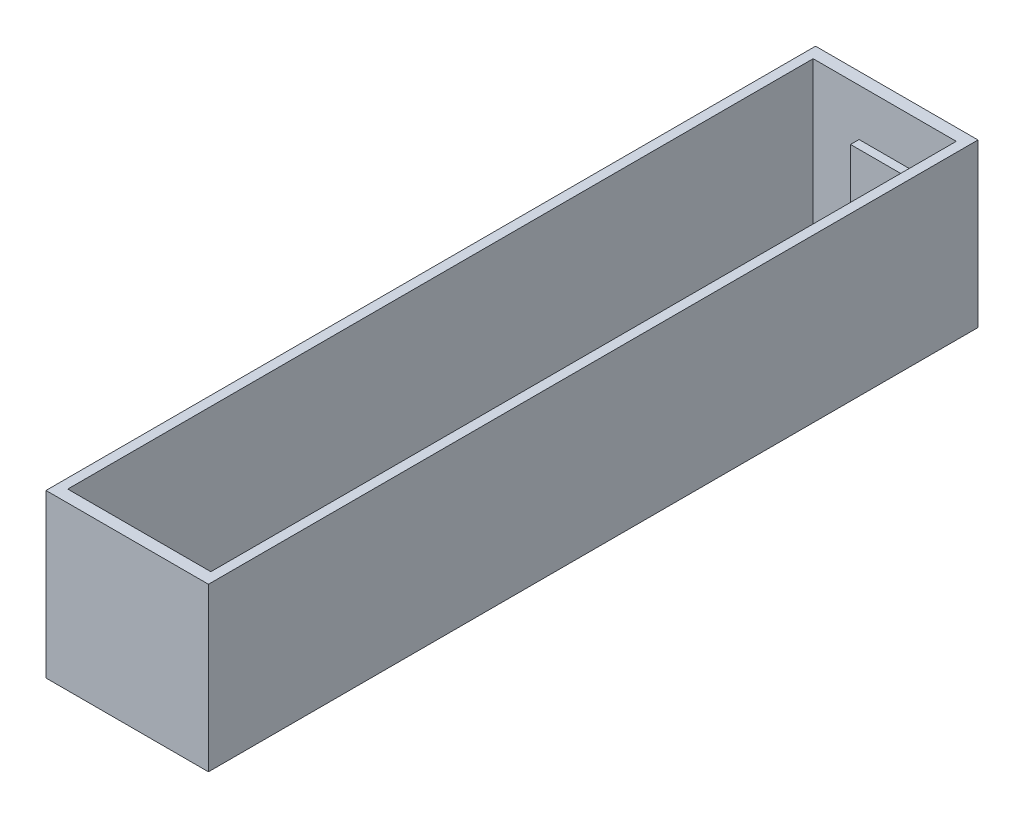
ISO-10303-21;
HEADER;
FILE_DESCRIPTION(('STEP AP214'),'2;1');
FILE_NAME('part.step','',(''),(''),'','','');
FILE_SCHEMA(('AUTOMOTIVE_DESIGN { 1 0 10303 214 1 1 1 1 }'));
ENDSEC;
DATA;
#1=APPLICATION_CONTEXT('core data for automotive mechanical design processes');
#2=APPLICATION_PROTOCOL_DEFINITION('international standard','automotive_design',2000,#1);
#3=PRODUCT_CONTEXT('',#1,'mechanical');
#4=PRODUCT('Part','Part','',(#3));
#5=PRODUCT_RELATED_PRODUCT_CATEGORY('part','',(#4));
#6=PRODUCT_DEFINITION_FORMATION('','',#4);
#7=PRODUCT_DEFINITION_CONTEXT('part definition',#1,'design');
#8=PRODUCT_DEFINITION('design','',#6,#7);
#9=PRODUCT_DEFINITION_SHAPE('','',#8);
#10=(LENGTH_UNIT() NAMED_UNIT(*) SI_UNIT(.MILLI.,.METRE.));
#11=(NAMED_UNIT(*) PLANE_ANGLE_UNIT() SI_UNIT($,.RADIAN.));
#12=(NAMED_UNIT(*) SI_UNIT($,.STERADIAN.) SOLID_ANGLE_UNIT());
#13=UNCERTAINTY_MEASURE_WITH_UNIT(LENGTH_MEASURE(1.E-05),#10,'distance_accuracy_value','');
#14=(GEOMETRIC_REPRESENTATION_CONTEXT(3) GLOBAL_UNCERTAINTY_ASSIGNED_CONTEXT((#13)) GLOBAL_UNIT_ASSIGNED_CONTEXT((#10,
#11,#12)) REPRESENTATION_CONTEXT('',''));
#15=CARTESIAN_POINT('',(0.,0.,0.));
#16=DIRECTION('',(0.,0.,1.));
#17=DIRECTION('',(1.,0.,0.));
#18=AXIS2_PLACEMENT_3D('',#15,#16,#17);
#19=CARTESIAN_POINT('',(-11.9698623853211,2.,-75.3913176046101));
#20=DIRECTION('',(0.,0.,-1.));
#21=DIRECTION('',(-1.,0.,0.));
#22=AXIS2_PLACEMENT_3D('',#19,#20,#21);
#23=PLANE('',#22);
#24=DIRECTION('',(-1.,0.,0.));
#25=VECTOR('',#24,1.);
#26=CARTESIAN_POINT('',(-11.9698623853211,19.,-75.3913176046101));
#27=LINE('',#26,#25);
#28=CARTESIAN_POINT('',(4.77013761467889,19.,-75.3913176046101));
#29=VERTEX_POINT('',#28);
#30=CARTESIAN_POINT('',(-11.9698623853211,19.,-75.3913176046101));
#31=VERTEX_POINT('',#30);
#32=EDGE_CURVE('E210',#29,#31,#27,.T.);
#33=ORIENTED_EDGE('',*,*,#32,.T.);
#34=DIRECTION('',(0.,1.,0.));
#35=VECTOR('',#34,1.);
#36=CARTESIAN_POINT('',(-11.9698623853211,2.,-75.3913176046101));
#37=LINE('',#36,#35);
#38=CARTESIAN_POINT('',(-11.9698623853211,2.,-75.3913176046101));
#39=VERTEX_POINT('',#38);
#40=EDGE_CURVE('E229',#39,#31,#37,.T.);
#41=ORIENTED_EDGE('',*,*,#40,.F.);
#42=DIRECTION('',(-1.,0.,0.));
#43=VECTOR('',#42,1.);
#44=CARTESIAN_POINT('',(-11.9698623853211,2.,-75.3913176046101));
#45=LINE('',#44,#43);
#46=CARTESIAN_POINT('',(4.77013761467889,2.,-75.3913176046101));
#47=VERTEX_POINT('',#46);
#48=EDGE_CURVE('E216',#47,#39,#45,.T.);
#49=ORIENTED_EDGE('',*,*,#48,.F.);
#50=DIRECTION('',(0.,1.,0.));
#51=VECTOR('',#50,1.);
#52=CARTESIAN_POINT('',(4.77013761467889,2.,-75.3913176046101));
#53=LINE('',#52,#51);
#54=EDGE_CURVE('E232',#47,#29,#53,.T.);
#55=ORIENTED_EDGE('',*,*,#54,.T.);
#56=EDGE_LOOP('',(#33,#41,#49,#55));
#57=FACE_BOUND('',#56,.T.);
#58=DIRECTION('',(0.,-1.,0.));
#59=VECTOR('',#58,1.);
#60=CARTESIAN_POINT('',(-6.59986238532113,13.5,-75.3913176046101));
#61=LINE('',#60,#59);
#62=CARTESIAN_POINT('',(-6.59986238532113,13.5,-75.3913176046101));
#63=VERTEX_POINT('',#62);
#64=CARTESIAN_POINT('',(-6.59986238532113,7.5,-75.3913176046101));
#65=VERTEX_POINT('',#64);
#66=EDGE_CURVE('E167',#63,#65,#61,.T.);
#67=ORIENTED_EDGE('',*,*,#66,.F.);
#68=DIRECTION('',(-1.,0.,0.));
#69=VECTOR('',#68,1.);
#70=CARTESIAN_POINT('',(-6.59986238532113,13.5,-75.3913176046101));
#71=LINE('',#70,#69);
#72=CARTESIAN_POINT('',(-0.599862385321127,13.5,-75.3913176046101));
#73=VERTEX_POINT('',#72);
#74=EDGE_CURVE('E164',#73,#63,#71,.T.);
#75=ORIENTED_EDGE('',*,*,#74,.F.);
#76=DIRECTION('',(0.,1.,0.));
#77=VECTOR('',#76,1.);
#78=CARTESIAN_POINT('',(-0.599862385321127,13.5,-75.3913176046101));
#79=LINE('',#78,#77);
#80=CARTESIAN_POINT('',(-0.599862385321126,7.5,-75.3913176046101));
#81=VERTEX_POINT('',#80);
#82=EDGE_CURVE('E54',#81,#73,#79,.T.);
#83=ORIENTED_EDGE('',*,*,#82,.F.);
#84=DIRECTION('',(1.,0.,0.));
#85=VECTOR('',#84,1.);
#86=CARTESIAN_POINT('',(-6.59986238532113,7.5,-75.3913176046101));
#87=LINE('',#86,#85);
#88=EDGE_CURVE('E49',#65,#81,#87,.T.);
#89=ORIENTED_EDGE('',*,*,#88,.F.);
#90=EDGE_LOOP('',(#67,#75,#83,#89));
#91=FACE_BOUND('',#90,.T.);
#92=ADVANCED_FACE('F34',(#57,#91),#23,.F.);
#93=CARTESIAN_POINT('',(-11.9698623853211,2.,11.7886823953899));
#94=DIRECTION('',(0.,0.,1.));
#95=DIRECTION('',(1.,0.,0.));
#96=AXIS2_PLACEMENT_3D('',#93,#94,#95);
#97=PLANE('',#96);
#98=DIRECTION('',(1.,0.,0.));
#99=VECTOR('',#98,1.);
#100=CARTESIAN_POINT('',(-11.9698623853211,19.,11.7886823953899));
#101=LINE('',#100,#99);
#102=CARTESIAN_POINT('',(-11.9698623853211,19.,11.7886823953899));
#103=VERTEX_POINT('',#102);
#104=CARTESIAN_POINT('',(4.7701376146789,19.,11.7886823953899));
#105=VERTEX_POINT('',#104);
#106=EDGE_CURVE('E221',#103,#105,#101,.T.);
#107=ORIENTED_EDGE('',*,*,#106,.T.);
#108=DIRECTION('',(0.,1.,0.));
#109=VECTOR('',#108,1.);
#110=CARTESIAN_POINT('',(4.7701376146789,2.,11.7886823953899));
#111=LINE('',#110,#109);
#112=CARTESIAN_POINT('',(4.7701376146789,2.,11.7886823953899));
#113=VERTEX_POINT('',#112);
#114=EDGE_CURVE('E234',#113,#105,#111,.T.);
#115=ORIENTED_EDGE('',*,*,#114,.F.);
#116=DIRECTION('',(1.,0.,0.));
#117=VECTOR('',#116,1.);
#118=CARTESIAN_POINT('',(-11.9698623853211,2.,11.7886823953899));
#119=LINE('',#118,#117);
#120=CARTESIAN_POINT('',(-11.9698623853211,2.,11.7886823953899));
#121=VERTEX_POINT('',#120);
#122=EDGE_CURVE('E209',#121,#113,#119,.T.);
#123=ORIENTED_EDGE('',*,*,#122,.F.);
#124=DIRECTION('',(0.,1.,0.));
#125=VECTOR('',#124,1.);
#126=CARTESIAN_POINT('',(-11.9698623853211,2.,11.7886823953899));
#127=LINE('',#126,#125);
#128=EDGE_CURVE('E219',#121,#103,#127,.T.);
#129=ORIENTED_EDGE('',*,*,#128,.T.);
#130=EDGE_LOOP('',(#107,#115,#123,#129));
#131=FACE_BOUND('',#130,.T.);
#132=DIRECTION('',(1.,0.,0.));
#133=VECTOR('',#132,1.);
#134=CARTESIAN_POINT('',(-6.5998623853211,13.5,11.7886823953899));
#135=LINE('',#134,#133);
#136=CARTESIAN_POINT('',(-6.5998623853211,13.5,11.7886823953899));
#137=VERTEX_POINT('',#136);
#138=CARTESIAN_POINT('',(-0.599862385321103,13.5,11.7886823953899));
#139=VERTEX_POINT('',#138);
#140=EDGE_CURVE('E168',#137,#139,#135,.T.);
#141=ORIENTED_EDGE('',*,*,#140,.F.);
#142=DIRECTION('',(0.,1.,0.));
#143=VECTOR('',#142,1.);
#144=CARTESIAN_POINT('',(-6.5998623853211,7.5,11.7886823953899));
#145=LINE('',#144,#143);
#146=CARTESIAN_POINT('',(-6.5998623853211,7.5,11.7886823953899));
#147=VERTEX_POINT('',#146);
#148=EDGE_CURVE('E180',#147,#137,#145,.T.);
#149=ORIENTED_EDGE('',*,*,#148,.F.);
#150=DIRECTION('',(1.,0.,0.));
#151=VECTOR('',#150,1.);
#152=CARTESIAN_POINT('',(-6.5998623853211,7.5,11.7886823953899));
#153=LINE('',#152,#151);
#154=CARTESIAN_POINT('',(-0.599862385321103,7.5,11.7886823953899));
#155=VERTEX_POINT('',#154);
#156=EDGE_CURVE('E190',#147,#155,#153,.T.);
#157=ORIENTED_EDGE('',*,*,#156,.T.);
#158=DIRECTION('',(0.,1.,0.));
#159=VECTOR('',#158,1.);
#160=CARTESIAN_POINT('',(-0.599862385321103,7.5,11.7886823953899));
#161=LINE('',#160,#159);
#162=EDGE_CURVE('E171',#155,#139,#161,.T.);
#163=ORIENTED_EDGE('',*,*,#162,.T.);
#164=EDGE_LOOP('',(#141,#149,#157,#163));
#165=FACE_BOUND('',#164,.T.);
#166=ADVANCED_FACE('F288',(#131,#165),#97,.F.);
#167=CARTESIAN_POINT('',(-13.0998623853211,19.,-76.8013176046101));
#168=DIRECTION('',(1.,0.,0.));
#169=DIRECTION('',(0.,0.,-1.));
#170=AXIS2_PLACEMENT_3D('',#167,#168,#169);
#171=PLANE('',#170);
#172=DIRECTION('',(0.,0.,1.));
#173=VECTOR('',#172,1.);
#174=CARTESIAN_POINT('',(-13.0998623853211,0.,-76.8013176046101));
#175=LINE('',#174,#173);
#176=CARTESIAN_POINT('',(-13.0998623853211,0.,-76.8013176046101));
#177=VERTEX_POINT('',#176);
#178=CARTESIAN_POINT('',(-13.0998623853211,0.,13.1986823953899));
#179=VERTEX_POINT('',#178);
#180=EDGE_CURVE('E231',#177,#179,#175,.T.);
#181=ORIENTED_EDGE('',*,*,#180,.T.);
#182=DIRECTION('',(0.,-1.,0.));
#183=VECTOR('',#182,1.);
#184=CARTESIAN_POINT('',(-13.0998623853211,19.,13.1986823953899));
#185=LINE('',#184,#183);
#186=CARTESIAN_POINT('',(-13.0998623853211,19.,13.1986823953899));
#187=VERTEX_POINT('',#186);
#188=EDGE_CURVE('E11',#187,#179,#185,.T.);
#189=ORIENTED_EDGE('',*,*,#188,.F.);
#190=DIRECTION('',(0.,0.,1.));
#191=VECTOR('',#190,1.);
#192=CARTESIAN_POINT('',(-13.0998623853211,19.,-76.8013176046101));
#193=LINE('',#192,#191);
#194=CARTESIAN_POINT('',(-13.0998623853211,19.,-76.8013176046101));
#195=VERTEX_POINT('',#194);
#196=EDGE_CURVE('E238',#195,#187,#193,.T.);
#197=ORIENTED_EDGE('',*,*,#196,.F.);
#198=DIRECTION('',(0.,-1.,0.));
#199=VECTOR('',#198,1.);
#200=CARTESIAN_POINT('',(-13.0998623853211,19.,-76.8013176046101));
#201=LINE('',#200,#199);
#202=EDGE_CURVE('E248',#195,#177,#201,.T.);
#203=ORIENTED_EDGE('',*,*,#202,.T.);
#204=EDGE_LOOP('',(#181,#189,#197,#203));
#205=FACE_BOUND('',#204,.T.);
#206=ADVANCED_FACE('F36',(#205),#171,.F.);
#207=CARTESIAN_POINT('',(-13.0998623853211,19.,13.1986823953899));
#208=DIRECTION('',(0.,0.,-1.));
#209=DIRECTION('',(-1.,0.,0.));
#210=AXIS2_PLACEMENT_3D('',#207,#208,#209);
#211=PLANE('',#210);
#212=DIRECTION('',(1.,0.,0.));
#213=VECTOR('',#212,1.);
#214=CARTESIAN_POINT('',(-13.0998623853211,0.,13.1986823953899));
#215=LINE('',#214,#213);
#216=CARTESIAN_POINT('',(5.90013761467889,0.,13.1986823953899));
#217=VERTEX_POINT('',#216);
#218=EDGE_CURVE('E251',#179,#217,#215,.T.);
#219=ORIENTED_EDGE('',*,*,#218,.T.);
#220=DIRECTION('',(0.,-1.,0.));
#221=VECTOR('',#220,1.);
#222=CARTESIAN_POINT('',(5.90013761467889,19.,13.1986823953899));
#223=LINE('',#222,#221);
#224=CARTESIAN_POINT('',(5.90013761467889,19.,13.1986823953899));
#225=VERTEX_POINT('',#224);
#226=EDGE_CURVE('E42',#225,#217,#223,.T.);
#227=ORIENTED_EDGE('',*,*,#226,.F.);
#228=DIRECTION('',(1.,0.,0.));
#229=VECTOR('',#228,1.);
#230=CARTESIAN_POINT('',(-13.0998623853211,19.,13.1986823953899));
#231=LINE('',#230,#229);
#232=EDGE_CURVE('E241',#187,#225,#231,.T.);
#233=ORIENTED_EDGE('',*,*,#232,.F.);
#234=ORIENTED_EDGE('',*,*,#188,.T.);
#235=EDGE_LOOP('',(#219,#227,#233,#234));
#236=FACE_BOUND('',#235,.T.);
#237=ADVANCED_FACE('F281',(#236),#211,.F.);
#238=CARTESIAN_POINT('',(5.90013761467887,19.,-76.8013176046101));
#239=DIRECTION('',(-1.,0.,0.));
#240=DIRECTION('',(0.,0.,1.));
#241=AXIS2_PLACEMENT_3D('',#238,#239,#240);
#242=PLANE('',#241);
#243=DIRECTION('',(0.,0.,-1.));
#244=VECTOR('',#243,1.);
#245=CARTESIAN_POINT('',(5.90013761467887,0.,-76.8013176046101));
#246=LINE('',#245,#244);
#247=CARTESIAN_POINT('',(5.90013761467887,0.,-76.8013176046101));
#248=VERTEX_POINT('',#247);
#249=EDGE_CURVE('E253',#217,#248,#246,.T.);
#250=ORIENTED_EDGE('',*,*,#249,.T.);
#251=DIRECTION('',(0.,-1.,0.));
#252=VECTOR('',#251,1.);
#253=CARTESIAN_POINT('',(5.90013761467887,19.,-76.8013176046101));
#254=LINE('',#253,#252);
#255=CARTESIAN_POINT('',(5.90013761467887,19.,-76.8013176046101));
#256=VERTEX_POINT('',#255);
#257=EDGE_CURVE('E258',#256,#248,#254,.T.);
#258=ORIENTED_EDGE('',*,*,#257,.F.);
#259=DIRECTION('',(0.,0.,-1.));
#260=VECTOR('',#259,1.);
#261=CARTESIAN_POINT('',(5.90013761467887,19.,-76.8013176046101));
#262=LINE('',#261,#260);
#263=EDGE_CURVE('E244',#225,#256,#262,.T.);
#264=ORIENTED_EDGE('',*,*,#263,.F.);
#265=ORIENTED_EDGE('',*,*,#226,.T.);
#266=EDGE_LOOP('',(#250,#258,#264,#265));
#267=FACE_BOUND('',#266,.T.);
#268=ADVANCED_FACE('F265',(#267),#242,.F.);
#269=CARTESIAN_POINT('',(-13.0998623853211,19.,-76.8013176046101));
#270=DIRECTION('',(0.,0.,1.));
#271=DIRECTION('',(1.,0.,0.));
#272=AXIS2_PLACEMENT_3D('',#269,#270,#271);
#273=PLANE('',#272);
#274=DIRECTION('',(-1.,0.,0.));
#275=VECTOR('',#274,1.);
#276=CARTESIAN_POINT('',(-13.0998623853211,0.,-76.8013176046101));
#277=LINE('',#276,#275);
#278=EDGE_CURVE('E242',#248,#177,#277,.T.);
#279=ORIENTED_EDGE('',*,*,#278,.T.);
#280=ORIENTED_EDGE('',*,*,#202,.F.);
#281=DIRECTION('',(-1.,0.,0.));
#282=VECTOR('',#281,1.);
#283=CARTESIAN_POINT('',(-13.0998623853211,19.,-76.8013176046101));
#284=LINE('',#283,#282);
#285=EDGE_CURVE('E246',#256,#195,#284,.T.);
#286=ORIENTED_EDGE('',*,*,#285,.F.);
#287=ORIENTED_EDGE('',*,*,#257,.T.);
#288=EDGE_LOOP('',(#279,#280,#286,#287));
#289=FACE_BOUND('',#288,.T.);
#290=ADVANCED_FACE('F274',(#289),#273,.F.);
#291=CARTESIAN_POINT('',(0.,19.,0.));
#292=DIRECTION('',(0.,1.,0.));
#293=DIRECTION('',(0.,0.,1.));
#294=AXIS2_PLACEMENT_3D('',#291,#292,#293);
#295=PLANE('',#294);
#296=DIRECTION('',(0.,0.,1.));
#297=VECTOR('',#296,1.);
#298=CARTESIAN_POINT('',(-11.9698623853211,19.,-75.3913176046101));
#299=LINE('',#298,#297);
#300=EDGE_CURVE('E205',#31,#103,#299,.T.);
#301=ORIENTED_EDGE('',*,*,#300,.F.);
#302=ORIENTED_EDGE('',*,*,#32,.F.);
#303=DIRECTION('',(0.,0.,-1.));
#304=VECTOR('',#303,1.);
#305=CARTESIAN_POINT('',(4.77013761467889,19.,-75.3913176046101));
#306=LINE('',#305,#304);
#307=EDGE_CURVE('E224',#105,#29,#306,.T.);
#308=ORIENTED_EDGE('',*,*,#307,.F.);
#309=ORIENTED_EDGE('',*,*,#106,.F.);
#310=EDGE_LOOP('',(#301,#302,#308,#309));
#311=FACE_BOUND('',#310,.T.);
#312=ORIENTED_EDGE('',*,*,#196,.T.);
#313=ORIENTED_EDGE('',*,*,#232,.T.);
#314=ORIENTED_EDGE('',*,*,#263,.T.);
#315=ORIENTED_EDGE('',*,*,#285,.T.);
#316=EDGE_LOOP('',(#312,#313,#314,#315));
#317=FACE_BOUND('',#316,.T.);
#318=ADVANCED_FACE('F280',(#311,#317),#295,.T.);
#319=CARTESIAN_POINT('',(0.,0.,0.));
#320=DIRECTION('',(0.,1.,0.));
#321=DIRECTION('',(0.,0.,1.));
#322=AXIS2_PLACEMENT_3D('',#319,#320,#321);
#323=PLANE('',#322);
#324=ORIENTED_EDGE('',*,*,#180,.F.);
#325=ORIENTED_EDGE('',*,*,#278,.F.);
#326=ORIENTED_EDGE('',*,*,#249,.F.);
#327=ORIENTED_EDGE('',*,*,#218,.F.);
#328=EDGE_LOOP('',(#324,#325,#326,#327));
#329=FACE_BOUND('',#328,.T.);
#330=ADVANCED_FACE('F271',(#329),#323,.F.);
#331=CARTESIAN_POINT('',(-11.9698623853211,2.,-75.3913176046101));
#332=DIRECTION('',(-1.,0.,0.));
#333=DIRECTION('',(0.,0.,1.));
#334=AXIS2_PLACEMENT_3D('',#331,#332,#333);
#335=PLANE('',#334);
#336=ORIENTED_EDGE('',*,*,#300,.T.);
#337=ORIENTED_EDGE('',*,*,#128,.F.);
#338=DIRECTION('',(0.,0.,1.));
#339=VECTOR('',#338,1.);
#340=CARTESIAN_POINT('',(-11.9698623853211,2.,-75.3913176046101));
#341=LINE('',#340,#339);
#342=EDGE_CURVE('E206',#39,#121,#341,.T.);
#343=ORIENTED_EDGE('',*,*,#342,.F.);
#344=ORIENTED_EDGE('',*,*,#40,.T.);
#345=EDGE_LOOP('',(#336,#337,#343,#344));
#346=FACE_BOUND('',#345,.T.);
#347=ADVANCED_FACE('F303',(#346),#335,.F.);
#348=CARTESIAN_POINT('',(4.77013761467889,2.,-75.3913176046101));
#349=DIRECTION('',(1.,0.,0.));
#350=DIRECTION('',(0.,0.,-1.));
#351=AXIS2_PLACEMENT_3D('',#348,#349,#350);
#352=PLANE('',#351);
#353=ORIENTED_EDGE('',*,*,#307,.T.);
#354=ORIENTED_EDGE('',*,*,#54,.F.);
#355=DIRECTION('',(0.,0.,-1.));
#356=VECTOR('',#355,1.);
#357=CARTESIAN_POINT('',(4.77013761467889,2.,-75.3913176046101));
#358=LINE('',#357,#356);
#359=EDGE_CURVE('E213',#113,#47,#358,.T.);
#360=ORIENTED_EDGE('',*,*,#359,.F.);
#361=ORIENTED_EDGE('',*,*,#114,.T.);
#362=EDGE_LOOP('',(#353,#354,#360,#361));
#363=FACE_BOUND('',#362,.T.);
#364=ADVANCED_FACE('F301',(#363),#352,.F.);
#365=CARTESIAN_POINT('',(0.,2.,0.));
#366=DIRECTION('',(0.,1.,0.));
#367=DIRECTION('',(0.,0.,1.));
#368=AXIS2_PLACEMENT_3D('',#365,#366,#367);
#369=PLANE('',#368);
#370=ORIENTED_EDGE('',*,*,#342,.T.);
#371=ORIENTED_EDGE('',*,*,#122,.T.);
#372=ORIENTED_EDGE('',*,*,#359,.T.);
#373=ORIENTED_EDGE('',*,*,#48,.T.);
#374=EDGE_LOOP('',(#370,#371,#372,#373));
#375=FACE_BOUND('',#374,.T.);
#376=ADVANCED_FACE('F299',(#375),#369,.T.);
#377=CARTESIAN_POINT('',(-6.5998623853211,13.5,10.7886823953899));
#378=DIRECTION('',(0.,-1.,0.));
#379=DIRECTION('',(0.,0.,-1.));
#380=AXIS2_PLACEMENT_3D('',#377,#378,#379);
#381=PLANE('',#380);
#382=ORIENTED_EDGE('',*,*,#140,.T.);
#383=DIRECTION('',(0.,0.,1.));
#384=VECTOR('',#383,1.);
#385=CARTESIAN_POINT('',(-0.599862385321103,13.5,10.7886823953899));
#386=LINE('',#385,#384);
#387=CARTESIAN_POINT('',(-0.599862385321103,13.5,10.7886823953899));
#388=VERTEX_POINT('',#387);
#389=EDGE_CURVE('E202',#388,#139,#386,.T.);
#390=ORIENTED_EDGE('',*,*,#389,.F.);
#391=DIRECTION('',(1.,0.,0.));
#392=VECTOR('',#391,1.);
#393=CARTESIAN_POINT('',(-6.5998623853211,13.5,10.7886823953899));
#394=LINE('',#393,#392);
#395=CARTESIAN_POINT('',(-6.5998623853211,13.5,10.7886823953899));
#396=VERTEX_POINT('',#395);
#397=EDGE_CURVE('E177',#396,#388,#394,.T.);
#398=ORIENTED_EDGE('',*,*,#397,.F.);
#399=DIRECTION('',(0.,0.,1.));
#400=VECTOR('',#399,1.);
#401=CARTESIAN_POINT('',(-6.5998623853211,13.5,10.7886823953899));
#402=LINE('',#401,#400);
#403=EDGE_CURVE('E187',#396,#137,#402,.T.);
#404=ORIENTED_EDGE('',*,*,#403,.T.);
#405=EDGE_LOOP('',(#382,#390,#398,#404));
#406=FACE_BOUND('',#405,.T.);
#407=ADVANCED_FACE('F342',(#406),#381,.F.);
#408=CARTESIAN_POINT('',(-0.599862385321103,7.5,10.7886823953899));
#409=DIRECTION('',(1.,0.,0.));
#410=DIRECTION('',(0.,0.,-1.));
#411=AXIS2_PLACEMENT_3D('',#408,#409,#410);
#412=PLANE('',#411);
#413=ORIENTED_EDGE('',*,*,#162,.F.);
#414=DIRECTION('',(0.,0.,1.));
#415=VECTOR('',#414,1.);
#416=CARTESIAN_POINT('',(-0.599862385321103,7.5,10.7886823953899));
#417=LINE('',#416,#415);
#418=CARTESIAN_POINT('',(-0.599862385321103,7.5,10.7886823953899));
#419=VERTEX_POINT('',#418);
#420=EDGE_CURVE('E199',#419,#155,#417,.T.);
#421=ORIENTED_EDGE('',*,*,#420,.F.);
#422=DIRECTION('',(0.,1.,0.));
#423=VECTOR('',#422,1.);
#424=CARTESIAN_POINT('',(-0.599862385321103,7.5,10.7886823953899));
#425=LINE('',#424,#423);
#426=EDGE_CURVE('E179',#419,#388,#425,.T.);
#427=ORIENTED_EDGE('',*,*,#426,.T.);
#428=ORIENTED_EDGE('',*,*,#389,.T.);
#429=EDGE_LOOP('',(#413,#421,#427,#428));
#430=FACE_BOUND('',#429,.T.);
#431=ADVANCED_FACE('F350',(#430),#412,.T.);
#432=CARTESIAN_POINT('',(-6.5998623853211,7.5,10.7886823953899));
#433=DIRECTION('',(0.,-1.,0.));
#434=DIRECTION('',(1.,0.,0.));
#435=AXIS2_PLACEMENT_3D('',#432,#433,#434);
#436=PLANE('',#435);
#437=ORIENTED_EDGE('',*,*,#156,.F.);
#438=DIRECTION('',(0.,0.,1.));
#439=VECTOR('',#438,1.);
#440=CARTESIAN_POINT('',(-6.5998623853211,7.5,10.7886823953899));
#441=LINE('',#440,#439);
#442=CARTESIAN_POINT('',(-6.5998623853211,7.5,10.7886823953899));
#443=VERTEX_POINT('',#442);
#444=EDGE_CURVE('E196',#443,#147,#441,.T.);
#445=ORIENTED_EDGE('',*,*,#444,.F.);
#446=DIRECTION('',(1.,0.,0.));
#447=VECTOR('',#446,1.);
#448=CARTESIAN_POINT('',(-6.5998623853211,7.5,10.7886823953899));
#449=LINE('',#448,#447);
#450=EDGE_CURVE('E183',#443,#419,#449,.T.);
#451=ORIENTED_EDGE('',*,*,#450,.T.);
#452=ORIENTED_EDGE('',*,*,#420,.T.);
#453=EDGE_LOOP('',(#437,#445,#451,#452));
#454=FACE_BOUND('',#453,.T.);
#455=ADVANCED_FACE('F358',(#454),#436,.T.);
#456=CARTESIAN_POINT('',(-6.5998623853211,7.5,10.7886823953899));
#457=DIRECTION('',(1.,0.,0.));
#458=DIRECTION('',(0.,0.,-1.));
#459=AXIS2_PLACEMENT_3D('',#456,#457,#458);
#460=PLANE('',#459);
#461=ORIENTED_EDGE('',*,*,#148,.T.);
#462=ORIENTED_EDGE('',*,*,#403,.F.);
#463=DIRECTION('',(0.,1.,0.));
#464=VECTOR('',#463,1.);
#465=CARTESIAN_POINT('',(-6.5998623853211,7.5,10.7886823953899));
#466=LINE('',#465,#464);
#467=EDGE_CURVE('E186',#443,#396,#466,.T.);
#468=ORIENTED_EDGE('',*,*,#467,.F.);
#469=ORIENTED_EDGE('',*,*,#444,.T.);
#470=EDGE_LOOP('',(#461,#462,#468,#469));
#471=FACE_BOUND('',#470,.T.);
#472=ADVANCED_FACE('F366',(#471),#460,.F.);
#473=CARTESIAN_POINT('',(0.,0.,10.7886823953899));
#474=DIRECTION('',(0.,0.,1.));
#475=DIRECTION('',(1.,0.,0.));
#476=AXIS2_PLACEMENT_3D('',#473,#474,#475);
#477=PLANE('',#476);
#478=ORIENTED_EDGE('',*,*,#397,.T.);
#479=ORIENTED_EDGE('',*,*,#426,.F.);
#480=ORIENTED_EDGE('',*,*,#450,.F.);
#481=ORIENTED_EDGE('',*,*,#467,.T.);
#482=EDGE_LOOP('',(#478,#479,#480,#481));
#483=FACE_BOUND('',#482,.T.);
#484=ADVANCED_FACE('F374',(#483),#477,.F.);
#485=CARTESIAN_POINT('',(-6.59986238532113,13.5,-74.3913176046101));
#486=DIRECTION('',(1.,0.,0.));
#487=DIRECTION('',(0.,1.,0.));
#488=AXIS2_PLACEMENT_3D('',#485,#486,#487);
#489=PLANE('',#488);
#490=ORIENTED_EDGE('',*,*,#66,.T.);
#491=DIRECTION('',(0.,0.,-1.));
#492=VECTOR('',#491,1.);
#493=CARTESIAN_POINT('',(-6.59986238532113,7.5,-74.3913176046101));
#494=LINE('',#493,#492);
#495=CARTESIAN_POINT('',(-6.59986238532113,7.5,-74.3913176046101));
#496=VERTEX_POINT('',#495);
#497=EDGE_CURVE('E148',#496,#65,#494,.T.);
#498=ORIENTED_EDGE('',*,*,#497,.F.);
#499=DIRECTION('',(0.,-1.,0.));
#500=VECTOR('',#499,1.);
#501=CARTESIAN_POINT('',(-6.59986238532113,13.5,-74.3913176046101));
#502=LINE('',#501,#500);
#503=CARTESIAN_POINT('',(-6.59986238532113,13.5,-74.3913176046101));
#504=VERTEX_POINT('',#503);
#505=EDGE_CURVE('E155',#504,#496,#502,.T.);
#506=ORIENTED_EDGE('',*,*,#505,.F.);
#507=DIRECTION('',(0.,0.,-1.));
#508=VECTOR('',#507,1.);
#509=CARTESIAN_POINT('',(-6.59986238532113,13.5,-74.3913176046101));
#510=LINE('',#509,#508);
#511=EDGE_CURVE('E494',#504,#63,#510,.T.);
#512=ORIENTED_EDGE('',*,*,#511,.T.);
#513=EDGE_LOOP('',(#490,#498,#506,#512));
#514=FACE_BOUND('',#513,.T.);
#515=ADVANCED_FACE('F166',(#514),#489,.F.);
#516=CARTESIAN_POINT('',(-6.59986238532113,7.5,-74.3913176046101));
#517=DIRECTION('',(0.,1.,0.));
#518=DIRECTION('',(0.,0.,1.));
#519=AXIS2_PLACEMENT_3D('',#516,#517,#518);
#520=PLANE('',#519);
#521=ORIENTED_EDGE('',*,*,#88,.T.);
#522=DIRECTION('',(0.,0.,-1.));
#523=VECTOR('',#522,1.);
#524=CARTESIAN_POINT('',(-0.599862385321126,7.5,-74.3913176046101));
#525=LINE('',#524,#523);
#526=CARTESIAN_POINT('',(-0.599862385321126,7.5,-74.3913176046101));
#527=VERTEX_POINT('',#526);
#528=EDGE_CURVE('E151',#527,#81,#525,.T.);
#529=ORIENTED_EDGE('',*,*,#528,.F.);
#530=DIRECTION('',(1.,0.,0.));
#531=VECTOR('',#530,1.);
#532=CARTESIAN_POINT('',(-6.59986238532113,7.5,-74.3913176046101));
#533=LINE('',#532,#531);
#534=EDGE_CURVE('E144',#496,#527,#533,.T.);
#535=ORIENTED_EDGE('',*,*,#534,.F.);
#536=ORIENTED_EDGE('',*,*,#497,.T.);
#537=EDGE_LOOP('',(#521,#529,#535,#536));
#538=FACE_BOUND('',#537,.T.);
#539=ADVANCED_FACE('F146',(#538),#520,.F.);
#540=CARTESIAN_POINT('',(-0.599862385321127,13.5,-74.3913176046101));
#541=DIRECTION('',(-1.,0.,0.));
#542=DIRECTION('',(0.,-1.,0.));
#543=AXIS2_PLACEMENT_3D('',#540,#541,#542);
#544=PLANE('',#543);
#545=ORIENTED_EDGE('',*,*,#82,.T.);
#546=DIRECTION('',(0.,0.,-1.));
#547=VECTOR('',#546,1.);
#548=CARTESIAN_POINT('',(-0.599862385321127,13.5,-74.3913176046101));
#549=LINE('',#548,#547);
#550=CARTESIAN_POINT('',(-0.599862385321127,13.5,-74.3913176046101));
#551=VERTEX_POINT('',#550);
#552=EDGE_CURVE('E173',#551,#73,#549,.T.);
#553=ORIENTED_EDGE('',*,*,#552,.F.);
#554=DIRECTION('',(0.,1.,0.));
#555=VECTOR('',#554,1.);
#556=CARTESIAN_POINT('',(-0.599862385321127,13.5,-74.3913176046101));
#557=LINE('',#556,#555);
#558=EDGE_CURVE('E154',#527,#551,#557,.T.);
#559=ORIENTED_EDGE('',*,*,#558,.F.);
#560=ORIENTED_EDGE('',*,*,#528,.T.);
#561=EDGE_LOOP('',(#545,#553,#559,#560));
#562=FACE_BOUND('',#561,.T.);
#563=ADVANCED_FACE('F396',(#562),#544,.F.);
#564=CARTESIAN_POINT('',(-6.59986238532113,13.5,-74.3913176046101));
#565=DIRECTION('',(0.,-1.,0.));
#566=DIRECTION('',(1.,0.,0.));
#567=AXIS2_PLACEMENT_3D('',#564,#565,#566);
#568=PLANE('',#567);
#569=ORIENTED_EDGE('',*,*,#74,.T.);
#570=ORIENTED_EDGE('',*,*,#511,.F.);
#571=DIRECTION('',(-1.,0.,0.));
#572=VECTOR('',#571,1.);
#573=CARTESIAN_POINT('',(-6.59986238532113,13.5,-74.3913176046101));
#574=LINE('',#573,#572);
#575=EDGE_CURVE('E160',#551,#504,#574,.T.);
#576=ORIENTED_EDGE('',*,*,#575,.F.);
#577=ORIENTED_EDGE('',*,*,#552,.T.);
#578=EDGE_LOOP('',(#569,#570,#576,#577));
#579=FACE_BOUND('',#578,.T.);
#580=ADVANCED_FACE('F403',(#579),#568,.F.);
#581=CARTESIAN_POINT('',(0.,0.,-74.3913176046101));
#582=DIRECTION('',(0.,0.,1.));
#583=DIRECTION('',(1.,0.,0.));
#584=AXIS2_PLACEMENT_3D('',#581,#582,#583);
#585=PLANE('',#584);
#586=ORIENTED_EDGE('',*,*,#505,.T.);
#587=ORIENTED_EDGE('',*,*,#534,.T.);
#588=ORIENTED_EDGE('',*,*,#558,.T.);
#589=ORIENTED_EDGE('',*,*,#575,.T.);
#590=EDGE_LOOP('',(#586,#587,#588,#589));
#591=FACE_BOUND('',#590,.T.);
#592=ADVANCED_FACE('F158',(#591),#585,.T.);
#593=CLOSED_SHELL('',(#92,#166,#206,#237,#268,#290,#318,#330,#347,#364,#376,#407,#431,#455,#472,
#484,#515,#539,#563,#580,#592));
#594=MANIFOLD_SOLID_BREP('B2',#593);
#595=ADVANCED_BREP_SHAPE_REPRESENTATION('',(#18,#594),#14);
#596=SHAPE_DEFINITION_REPRESENTATION(#9,#595);
ENDSEC;
END-ISO-10303-21;
